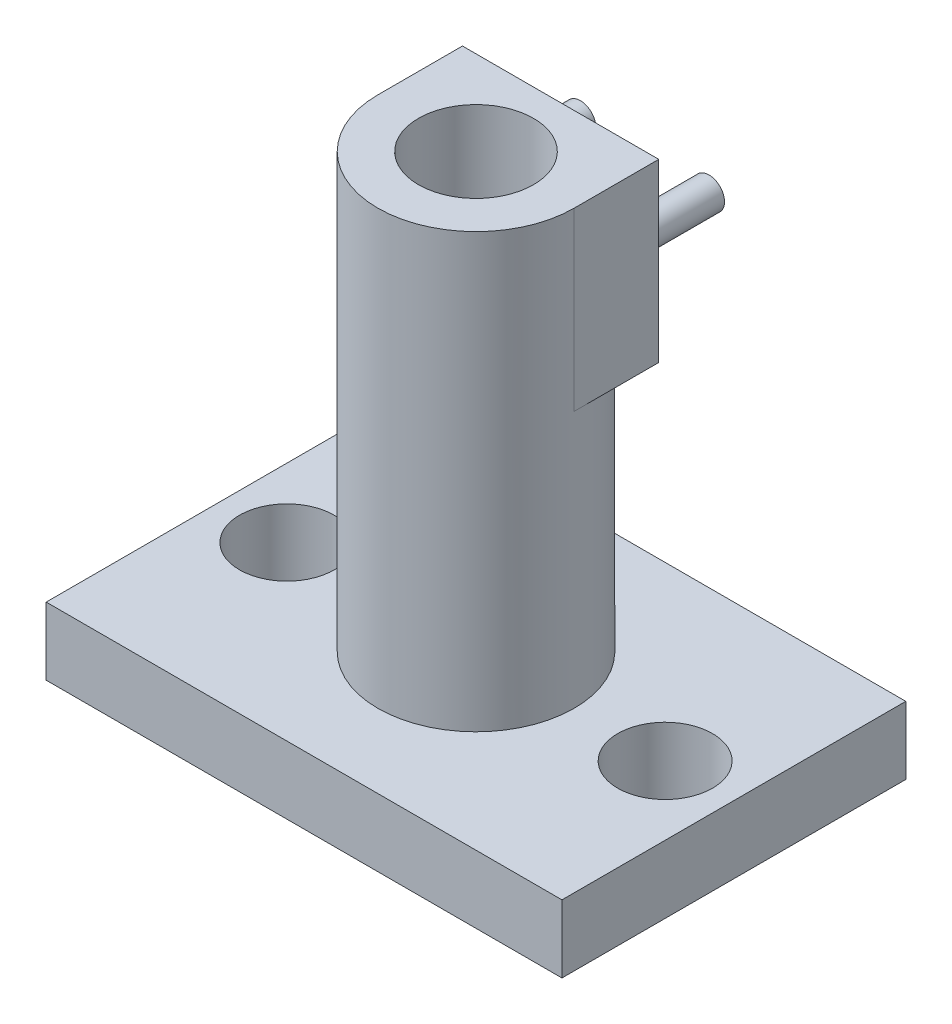
ISO-10303-21;
HEADER;
FILE_DESCRIPTION(('STEP AP214'),'2;1');
FILE_NAME('part.step','',(''),(''),'','','');
FILE_SCHEMA(('AUTOMOTIVE_DESIGN { 1 0 10303 214 1 1 1 1 }'));
ENDSEC;
DATA;
#1=APPLICATION_CONTEXT('core data for automotive mechanical design processes');
#2=APPLICATION_PROTOCOL_DEFINITION('international standard','automotive_design',2000,#1);
#3=PRODUCT_CONTEXT('',#1,'mechanical');
#4=PRODUCT('Part','Part','',(#3));
#5=PRODUCT_RELATED_PRODUCT_CATEGORY('part','',(#4));
#6=PRODUCT_DEFINITION_FORMATION('','',#4);
#7=PRODUCT_DEFINITION_CONTEXT('part definition',#1,'design');
#8=PRODUCT_DEFINITION('design','',#6,#7);
#9=PRODUCT_DEFINITION_SHAPE('','',#8);
#10=(LENGTH_UNIT() NAMED_UNIT(*) SI_UNIT(.MILLI.,.METRE.));
#11=(NAMED_UNIT(*) PLANE_ANGLE_UNIT() SI_UNIT($,.RADIAN.));
#12=(NAMED_UNIT(*) SI_UNIT($,.STERADIAN.) SOLID_ANGLE_UNIT());
#13=UNCERTAINTY_MEASURE_WITH_UNIT(LENGTH_MEASURE(1.E-05),#10,'distance_accuracy_value','');
#14=(GEOMETRIC_REPRESENTATION_CONTEXT(3) GLOBAL_UNCERTAINTY_ASSIGNED_CONTEXT((#13)) GLOBAL_UNIT_ASSIGNED_CONTEXT((#10,
#11,#12)) REPRESENTATION_CONTEXT('',''));
#15=CARTESIAN_POINT('',(0.,0.,0.));
#16=DIRECTION('',(0.,0.,1.));
#17=DIRECTION('',(1.,0.,0.));
#18=AXIS2_PLACEMENT_3D('',#15,#16,#17);
#19=CARTESIAN_POINT('',(-3.11750451625999,19.,-6.25000000000001));
#20=DIRECTION('',(0.,0.,1.));
#21=DIRECTION('',(1.,0.,0.));
#22=AXIS2_PLACEMENT_3D('',#19,#20,#21);
#23=PLANE('',#22);
#24=CARTESIAN_POINT('',(-2.04173913043476,30.5,-6.25000000000001));
#25=DIRECTION('',(0.,0.,1.));
#26=DIRECTION('',(1.,0.,0.));
#27=AXIS2_PLACEMENT_3D('',#24,#25,#26);
#28=CIRCLE('',#27,1.15);
#29=CARTESIAN_POINT('',(-0.89173913043476,30.5,-6.25000000000001));
#30=VERTEX_POINT('',#29);
#31=EDGE_CURVE('E41',#30,#30,#28,.F.);
#32=ORIENTED_EDGE('',*,*,#31,.F.);
#33=EDGE_LOOP('',(#32));
#34=FACE_BOUND('',#33,.T.);
#35=DIRECTION('',(1.,0.,0.));
#36=VECTOR('',#35,1.);
#37=CARTESIAN_POINT('',(-3.11750451625999,37.,-6.25000000000001));
#38=LINE('',#37,#36);
#39=CARTESIAN_POINT('',(-14.0417391304348,37.,-6.25000000000001));
#40=VERTEX_POINT('',#39);
#41=CARTESIAN_POINT('',(0.458260869565243,37.,-6.25000000000001));
#42=VERTEX_POINT('',#41);
#43=EDGE_CURVE('E116',#40,#42,#38,.T.);
#44=ORIENTED_EDGE('',*,*,#43,.T.);
#45=DIRECTION('',(0.,1.,0.));
#46=VECTOR('',#45,1.);
#47=CARTESIAN_POINT('',(0.458260869565243,24.,-6.25000000000001));
#48=LINE('',#47,#46);
#49=CARTESIAN_POINT('',(0.458260869565243,24.,-6.25000000000001));
#50=VERTEX_POINT('',#49);
#51=EDGE_CURVE('E109',#50,#42,#48,.T.);
#52=ORIENTED_EDGE('',*,*,#51,.F.);
#53=DIRECTION('',(-1.,0.,0.));
#54=VECTOR('',#53,1.);
#55=CARTESIAN_POINT('',(-3.11750451625999,24.,-6.25000000000001));
#56=LINE('',#55,#54);
#57=CARTESIAN_POINT('',(-3.11750451625999,24.,-6.25000000000001));
#58=VERTEX_POINT('',#57);
#59=EDGE_CURVE('E114',#50,#58,#56,.T.);
#60=ORIENTED_EDGE('',*,*,#59,.T.);
#61=DIRECTION('',(0.,1.,0.));
#62=VECTOR('',#61,1.);
#63=CARTESIAN_POINT('',(-3.11750451625999,19.,-6.25000000000001));
#64=LINE('',#63,#62);
#65=CARTESIAN_POINT('',(-3.11750451625999,19.,-6.25000000000001));
#66=VERTEX_POINT('',#65);
#67=EDGE_CURVE('E156',#66,#58,#64,.T.);
#68=ORIENTED_EDGE('',*,*,#67,.F.);
#69=DIRECTION('',(1.,0.,0.));
#70=VECTOR('',#69,1.);
#71=CARTESIAN_POINT('',(-3.11750451625999,19.,-6.25000000000001));
#72=LINE('',#71,#70);
#73=CARTESIAN_POINT('',(-10.4659737446095,19.,-6.25000000000001));
#74=VERTEX_POINT('',#73);
#75=EDGE_CURVE('E152',#74,#66,#72,.T.);
#76=ORIENTED_EDGE('',*,*,#75,.F.);
#77=DIRECTION('',(0.,1.,0.));
#78=VECTOR('',#77,1.);
#79=CARTESIAN_POINT('',(-10.4659737446095,19.,-6.25000000000001));
#80=LINE('',#79,#78);
#81=CARTESIAN_POINT('',(-10.4659737446095,24.,-6.25000000000001));
#82=VERTEX_POINT('',#81);
#83=EDGE_CURVE('E154',#74,#82,#80,.T.);
#84=ORIENTED_EDGE('',*,*,#83,.T.);
#85=DIRECTION('',(-1.,0.,0.));
#86=VECTOR('',#85,1.);
#87=CARTESIAN_POINT('',(-14.0417391304348,24.,-6.25000000000001));
#88=LINE('',#87,#86);
#89=CARTESIAN_POINT('',(-14.0417391304348,24.,-6.25000000000001));
#90=VERTEX_POINT('',#89);
#91=EDGE_CURVE('E138',#82,#90,#88,.T.);
#92=ORIENTED_EDGE('',*,*,#91,.T.);
#93=DIRECTION('',(0.,1.,0.));
#94=VECTOR('',#93,1.);
#95=CARTESIAN_POINT('',(-14.0417391304348,24.,-6.25000000000001));
#96=LINE('',#95,#94);
#97=EDGE_CURVE('E144',#90,#40,#96,.T.);
#98=ORIENTED_EDGE('',*,*,#97,.T.);
#99=EDGE_LOOP('',(#44,#52,#60,#68,#76,#84,#92,#98));
#100=FACE_BOUND('',#99,.T.);
#101=CARTESIAN_POINT('',(-11.5417391304348,30.5,-6.25000000000001));
#102=DIRECTION('',(0.,0.,1.));
#103=DIRECTION('',(1.,0.,0.));
#104=AXIS2_PLACEMENT_3D('',#101,#102,#103);
#105=CIRCLE('',#104,1.15);
#106=CARTESIAN_POINT('',(-10.3917391304348,30.5,-6.25000000000001));
#107=VERTEX_POINT('',#106);
#108=EDGE_CURVE('E11',#107,#107,#105,.F.);
#109=ORIENTED_EDGE('',*,*,#108,.F.);
#110=EDGE_LOOP('',(#109));
#111=FACE_BOUND('',#110,.T.);
#112=ADVANCED_FACE('F33',(#34,#100,#111),#23,.F.);
#113=CARTESIAN_POINT('',(-6.79173913043476,37.,0.));
#114=DIRECTION('',(0.,-1.,0.));
#115=DIRECTION('',(0.,0.,-1.));
#116=AXIS2_PLACEMENT_3D('',#113,#114,#115);
#117=CYLINDRICAL_SURFACE('',#116,7.25);
#118=CARTESIAN_POINT('',(-6.79173913043476,5.,0.));
#119=DIRECTION('',(0.,1.,0.));
#120=DIRECTION('',(0.,0.,1.));
#121=AXIS2_PLACEMENT_3D('',#118,#119,#120);
#122=CIRCLE('',#121,7.25);
#123=CARTESIAN_POINT('',(-6.79173913043476,5.,7.24999999999999));
#124=VERTEX_POINT('',#123);
#125=EDGE_CURVE('E175',#124,#124,#122,.T.);
#126=ORIENTED_EDGE('',*,*,#125,.T.);
#127=EDGE_LOOP('',(#126));
#128=FACE_BOUND('',#127,.T.);
#129=DIRECTION('',(0.,1.,0.));
#130=VECTOR('',#129,1.);
#131=CARTESIAN_POINT('',(0.458260869565244,24.,0.));
#132=LINE('',#131,#130);
#133=CARTESIAN_POINT('',(0.458260869565244,24.,0.));
#134=VERTEX_POINT('',#133);
#135=CARTESIAN_POINT('',(0.458260869565244,37.,0.));
#136=VERTEX_POINT('',#135);
#137=EDGE_CURVE('E52',#134,#136,#132,.T.);
#138=ORIENTED_EDGE('',*,*,#137,.T.);
#139=CARTESIAN_POINT('',(-6.79173913043476,37.,0.));
#140=DIRECTION('',(0.,1.,0.));
#141=DIRECTION('',(0.,0.,1.));
#142=AXIS2_PLACEMENT_3D('',#139,#140,#141);
#143=CIRCLE('',#142,7.25);
#144=CARTESIAN_POINT('',(-14.0417391304348,37.,0.));
#145=VERTEX_POINT('',#144);
#146=EDGE_CURVE('E176',#145,#136,#143,.T.);
#147=ORIENTED_EDGE('',*,*,#146,.F.);
#148=DIRECTION('',(0.,1.,0.));
#149=VECTOR('',#148,1.);
#150=CARTESIAN_POINT('',(-14.0417391304348,24.,0.));
#151=LINE('',#150,#149);
#152=CARTESIAN_POINT('',(-14.0417391304348,24.,0.));
#153=VERTEX_POINT('',#152);
#154=EDGE_CURVE('E147',#153,#145,#151,.T.);
#155=ORIENTED_EDGE('',*,*,#154,.F.);
#156=CARTESIAN_POINT('',(-6.79173913043476,24.,0.));
#157=DIRECTION('',(0.,-1.,0.));
#158=DIRECTION('',(0.,0.,1.));
#159=AXIS2_PLACEMENT_3D('',#156,#157,#158);
#160=CIRCLE('',#159,7.25);
#161=EDGE_CURVE('E135',#153,#82,#160,.T.);
#162=ORIENTED_EDGE('',*,*,#161,.T.);
#163=ORIENTED_EDGE('',*,*,#83,.F.);
#164=CARTESIAN_POINT('',(-6.79173913043476,19.,0.));
#165=DIRECTION('',(0.,1.,0.));
#166=DIRECTION('',(0.,0.,1.));
#167=AXIS2_PLACEMENT_3D('',#164,#165,#166);
#168=CIRCLE('',#167,7.25);
#169=EDGE_CURVE('E150',#66,#74,#168,.T.);
#170=ORIENTED_EDGE('',*,*,#169,.F.);
#171=ORIENTED_EDGE('',*,*,#67,.T.);
#172=CARTESIAN_POINT('',(-6.79173913043476,24.,0.));
#173=DIRECTION('',(0.,-1.,0.));
#174=DIRECTION('',(0.,0.,1.));
#175=AXIS2_PLACEMENT_3D('',#172,#173,#174);
#176=CIRCLE('',#175,7.25);
#177=EDGE_CURVE('E48',#58,#134,#176,.T.);
#178=ORIENTED_EDGE('',*,*,#177,.T.);
#179=EDGE_LOOP('',(#138,#147,#155,#162,#163,#170,#171,#178));
#180=FACE_BOUND('',#179,.T.);
#181=ADVANCED_FACE('F218',(#128,#180),#117,.T.);
#182=CARTESIAN_POINT('',(0.,5.,0.));
#183=DIRECTION('',(0.,1.,0.));
#184=DIRECTION('',(0.,0.,1.));
#185=AXIS2_PLACEMENT_3D('',#182,#183,#184);
#186=PLANE('',#185);
#187=CARTESIAN_POINT('',(-20.7617391304348,5.,0.));
#188=DIRECTION('',(0.,1.,0.));
#189=DIRECTION('',(0.,0.,1.));
#190=AXIS2_PLACEMENT_3D('',#187,#188,#189);
#191=CIRCLE('',#190,3.5);
#192=CARTESIAN_POINT('',(-20.7617391304348,5.,3.5));
#193=VERTEX_POINT('',#192);
#194=EDGE_CURVE('E158',#193,#193,#191,.T.);
#195=ORIENTED_EDGE('',*,*,#194,.F.);
#196=EDGE_LOOP('',(#195));
#197=FACE_BOUND('',#196,.T.);
#198=CARTESIAN_POINT('',(7.17826086956524,5.,0.));
#199=DIRECTION('',(0.,1.,0.));
#200=DIRECTION('',(0.,0.,1.));
#201=AXIS2_PLACEMENT_3D('',#198,#199,#200);
#202=CIRCLE('',#201,3.5);
#203=CARTESIAN_POINT('',(7.17826086956524,5.,3.5));
#204=VERTEX_POINT('',#203);
#205=EDGE_CURVE('E164',#204,#204,#202,.T.);
#206=ORIENTED_EDGE('',*,*,#205,.F.);
#207=EDGE_LOOP('',(#206));
#208=FACE_BOUND('',#207,.T.);
#209=DIRECTION('',(0.,0.,1.));
#210=VECTOR('',#209,1.);
#211=CARTESIAN_POINT('',(-25.8417391304348,5.,-12.7));
#212=LINE('',#211,#210);
#213=CARTESIAN_POINT('',(-25.8417391304348,5.,-12.7));
#214=VERTEX_POINT('',#213);
#215=CARTESIAN_POINT('',(-25.8417391304348,5.,12.7));
#216=VERTEX_POINT('',#215);
#217=EDGE_CURVE('E181',#214,#216,#212,.T.);
#218=ORIENTED_EDGE('',*,*,#217,.T.);
#219=DIRECTION('',(1.,0.,0.));
#220=VECTOR('',#219,1.);
#221=CARTESIAN_POINT('',(-25.8417391304348,5.,12.7));
#222=LINE('',#221,#220);
#223=CARTESIAN_POINT('',(12.2582608695652,5.,12.7));
#224=VERTEX_POINT('',#223);
#225=EDGE_CURVE('E184',#216,#224,#222,.T.);
#226=ORIENTED_EDGE('',*,*,#225,.T.);
#227=DIRECTION('',(0.,0.,-1.));
#228=VECTOR('',#227,1.);
#229=CARTESIAN_POINT('',(12.2582608695652,5.,-12.7));
#230=LINE('',#229,#228);
#231=CARTESIAN_POINT('',(12.2582608695652,5.,-12.7));
#232=VERTEX_POINT('',#231);
#233=EDGE_CURVE('E187',#224,#232,#230,.T.);
#234=ORIENTED_EDGE('',*,*,#233,.T.);
#235=DIRECTION('',(-1.,0.,0.));
#236=VECTOR('',#235,1.);
#237=CARTESIAN_POINT('',(-25.8417391304348,5.,-12.7));
#238=LINE('',#237,#236);
#239=EDGE_CURVE('E189',#232,#214,#238,.T.);
#240=ORIENTED_EDGE('',*,*,#239,.T.);
#241=EDGE_LOOP('',(#218,#226,#234,#240));
#242=FACE_BOUND('',#241,.T.);
#243=ORIENTED_EDGE('',*,*,#125,.F.);
#244=EDGE_LOOP('',(#243));
#245=FACE_BOUND('',#244,.T.);
#246=ADVANCED_FACE('F223',(#197,#208,#242,#245),#186,.T.);
#247=CARTESIAN_POINT('',(-25.8417391304348,5.,-12.7));
#248=DIRECTION('',(1.,0.,0.));
#249=DIRECTION('',(0.,0.,-1.));
#250=AXIS2_PLACEMENT_3D('',#247,#248,#249);
#251=PLANE('',#250);
#252=DIRECTION('',(0.,0.,1.));
#253=VECTOR('',#252,1.);
#254=CARTESIAN_POINT('',(-25.8417391304348,0.,-12.7));
#255=LINE('',#254,#253);
#256=CARTESIAN_POINT('',(-25.8417391304348,0.,-12.7));
#257=VERTEX_POINT('',#256);
#258=CARTESIAN_POINT('',(-25.8417391304348,0.,12.7));
#259=VERTEX_POINT('',#258);
#260=EDGE_CURVE('E178',#257,#259,#255,.T.);
#261=ORIENTED_EDGE('',*,*,#260,.T.);
#262=DIRECTION('',(0.,-1.,0.));
#263=VECTOR('',#262,1.);
#264=CARTESIAN_POINT('',(-25.8417391304348,5.,12.7));
#265=LINE('',#264,#263);
#266=EDGE_CURVE('E207',#216,#259,#265,.T.);
#267=ORIENTED_EDGE('',*,*,#266,.F.);
#268=ORIENTED_EDGE('',*,*,#217,.F.);
#269=DIRECTION('',(0.,-1.,0.));
#270=VECTOR('',#269,1.);
#271=CARTESIAN_POINT('',(-25.8417391304348,5.,-12.7));
#272=LINE('',#271,#270);
#273=EDGE_CURVE('E191',#214,#257,#272,.T.);
#274=ORIENTED_EDGE('',*,*,#273,.T.);
#275=EDGE_LOOP('',(#261,#267,#268,#274));
#276=FACE_BOUND('',#275,.T.);
#277=ADVANCED_FACE('F35',(#276),#251,.F.);
#278=CARTESIAN_POINT('',(-25.8417391304348,5.,12.7));
#279=DIRECTION('',(0.,0.,-1.));
#280=DIRECTION('',(-1.,0.,0.));
#281=AXIS2_PLACEMENT_3D('',#278,#279,#280);
#282=PLANE('',#281);
#283=DIRECTION('',(1.,0.,0.));
#284=VECTOR('',#283,1.);
#285=CARTESIAN_POINT('',(-25.8417391304348,0.,12.7));
#286=LINE('',#285,#284);
#287=CARTESIAN_POINT('',(12.2582608695652,0.,12.7));
#288=VERTEX_POINT('',#287);
#289=EDGE_CURVE('E194',#259,#288,#286,.T.);
#290=ORIENTED_EDGE('',*,*,#289,.T.);
#291=DIRECTION('',(0.,-1.,0.));
#292=VECTOR('',#291,1.);
#293=CARTESIAN_POINT('',(12.2582608695652,5.,12.7));
#294=LINE('',#293,#292);
#295=EDGE_CURVE('E204',#224,#288,#294,.T.);
#296=ORIENTED_EDGE('',*,*,#295,.F.);
#297=ORIENTED_EDGE('',*,*,#225,.F.);
#298=ORIENTED_EDGE('',*,*,#266,.T.);
#299=EDGE_LOOP('',(#290,#296,#297,#298));
#300=FACE_BOUND('',#299,.T.);
#301=ADVANCED_FACE('F260',(#300),#282,.F.);
#302=CARTESIAN_POINT('',(12.2582608695652,5.,-12.7));
#303=DIRECTION('',(-1.,0.,0.));
#304=DIRECTION('',(0.,0.,1.));
#305=AXIS2_PLACEMENT_3D('',#302,#303,#304);
#306=PLANE('',#305);
#307=DIRECTION('',(0.,0.,-1.));
#308=VECTOR('',#307,1.);
#309=CARTESIAN_POINT('',(12.2582608695652,0.,-12.7));
#310=LINE('',#309,#308);
#311=CARTESIAN_POINT('',(12.2582608695652,0.,-12.7));
#312=VERTEX_POINT('',#311);
#313=EDGE_CURVE('E196',#288,#312,#310,.T.);
#314=ORIENTED_EDGE('',*,*,#313,.T.);
#315=DIRECTION('',(0.,-1.,0.));
#316=VECTOR('',#315,1.);
#317=CARTESIAN_POINT('',(12.2582608695652,5.,-12.7));
#318=LINE('',#317,#316);
#319=EDGE_CURVE('E201',#232,#312,#318,.T.);
#320=ORIENTED_EDGE('',*,*,#319,.F.);
#321=ORIENTED_EDGE('',*,*,#233,.F.);
#322=ORIENTED_EDGE('',*,*,#295,.T.);
#323=EDGE_LOOP('',(#314,#320,#321,#322));
#324=FACE_BOUND('',#323,.T.);
#325=ADVANCED_FACE('F257',(#324),#306,.F.);
#326=CARTESIAN_POINT('',(-25.8417391304348,5.,-12.7));
#327=DIRECTION('',(0.,0.,1.));
#328=DIRECTION('',(1.,0.,0.));
#329=AXIS2_PLACEMENT_3D('',#326,#327,#328);
#330=PLANE('',#329);
#331=DIRECTION('',(-1.,0.,0.));
#332=VECTOR('',#331,1.);
#333=CARTESIAN_POINT('',(-25.8417391304348,0.,-12.7));
#334=LINE('',#333,#332);
#335=EDGE_CURVE('E185',#312,#257,#334,.T.);
#336=ORIENTED_EDGE('',*,*,#335,.T.);
#337=ORIENTED_EDGE('',*,*,#273,.F.);
#338=ORIENTED_EDGE('',*,*,#239,.F.);
#339=ORIENTED_EDGE('',*,*,#319,.T.);
#340=EDGE_LOOP('',(#336,#337,#338,#339));
#341=FACE_BOUND('',#340,.T.);
#342=ADVANCED_FACE('F253',(#341),#330,.F.);
#343=CARTESIAN_POINT('',(0.,0.,0.));
#344=DIRECTION('',(0.,1.,0.));
#345=DIRECTION('',(0.,0.,1.));
#346=AXIS2_PLACEMENT_3D('',#343,#344,#345);
#347=PLANE('',#346);
#348=CARTESIAN_POINT('',(-20.7617391304348,0.,0.));
#349=DIRECTION('',(0.,1.,0.));
#350=DIRECTION('',(0.,0.,1.));
#351=AXIS2_PLACEMENT_3D('',#348,#349,#350);
#352=CIRCLE('',#351,3.5);
#353=CARTESIAN_POINT('',(-20.7617391304348,0.,3.5));
#354=VERTEX_POINT('',#353);
#355=EDGE_CURVE('E161',#354,#354,#352,.T.);
#356=ORIENTED_EDGE('',*,*,#355,.T.);
#357=EDGE_LOOP('',(#356));
#358=FACE_BOUND('',#357,.T.);
#359=CARTESIAN_POINT('',(7.17826086956524,0.,0.));
#360=DIRECTION('',(0.,1.,0.));
#361=DIRECTION('',(0.,0.,1.));
#362=AXIS2_PLACEMENT_3D('',#359,#360,#361);
#363=CIRCLE('',#362,3.5);
#364=CARTESIAN_POINT('',(7.17826086956524,0.,3.5));
#365=VERTEX_POINT('',#364);
#366=EDGE_CURVE('E167',#365,#365,#363,.T.);
#367=ORIENTED_EDGE('',*,*,#366,.T.);
#368=EDGE_LOOP('',(#367));
#369=FACE_BOUND('',#368,.T.);
#370=ORIENTED_EDGE('',*,*,#260,.F.);
#371=ORIENTED_EDGE('',*,*,#335,.F.);
#372=ORIENTED_EDGE('',*,*,#313,.F.);
#373=ORIENTED_EDGE('',*,*,#289,.F.);
#374=EDGE_LOOP('',(#370,#371,#372,#373));
#375=FACE_BOUND('',#374,.T.);
#376=ADVANCED_FACE('F245',(#358,#369,#375),#347,.F.);
#377=CARTESIAN_POINT('',(-6.79173913043476,37.,0.));
#378=DIRECTION('',(0.,1.,0.));
#379=DIRECTION('',(0.,0.,1.));
#380=AXIS2_PLACEMENT_3D('',#377,#378,#379);
#381=PLANE('',#380);
#382=ORIENTED_EDGE('',*,*,#43,.F.);
#383=DIRECTION('',(0.,0.,1.));
#384=VECTOR('',#383,1.);
#385=CARTESIAN_POINT('',(-14.0417391304348,37.,0.));
#386=LINE('',#385,#384);
#387=EDGE_CURVE('E120',#40,#145,#386,.T.);
#388=ORIENTED_EDGE('',*,*,#387,.T.);
#389=ORIENTED_EDGE('',*,*,#146,.T.);
#390=DIRECTION('',(0.,0.,-1.));
#391=VECTOR('',#390,1.);
#392=CARTESIAN_POINT('',(0.458260869565244,37.,0.));
#393=LINE('',#392,#391);
#394=EDGE_CURVE('E132',#136,#42,#393,.T.);
#395=ORIENTED_EDGE('',*,*,#394,.T.);
#396=EDGE_LOOP('',(#382,#388,#389,#395));
#397=FACE_BOUND('',#396,.T.);
#398=CARTESIAN_POINT('',(-6.79173913043476,37.,0.));
#399=DIRECTION('',(0.,1.,0.));
#400=DIRECTION('',(0.,0.,1.));
#401=AXIS2_PLACEMENT_3D('',#398,#399,#400);
#402=CIRCLE('',#401,4.25);
#403=CARTESIAN_POINT('',(-6.79173913043476,37.,4.24999999999999));
#404=VERTEX_POINT('',#403);
#405=EDGE_CURVE('E170',#404,#404,#402,.T.);
#406=ORIENTED_EDGE('',*,*,#405,.F.);
#407=EDGE_LOOP('',(#406));
#408=FACE_BOUND('',#407,.T.);
#409=ADVANCED_FACE('F242',(#397,#408),#381,.T.);
#410=CARTESIAN_POINT('',(-6.79173913043476,37.,0.));
#411=DIRECTION('',(0.,-1.,0.));
#412=DIRECTION('',(0.,0.,-1.));
#413=AXIS2_PLACEMENT_3D('',#410,#411,#412);
#414=CYLINDRICAL_SURFACE('',#413,4.25);
#415=ORIENTED_EDGE('',*,*,#405,.T.);
#416=EDGE_LOOP('',(#415));
#417=FACE_BOUND('',#416,.T.);
#418=CARTESIAN_POINT('',(-6.79173913043476,5.,0.));
#419=DIRECTION('',(0.,1.,0.));
#420=DIRECTION('',(0.,0.,1.));
#421=AXIS2_PLACEMENT_3D('',#418,#419,#420);
#422=CIRCLE('',#421,4.25);
#423=CARTESIAN_POINT('',(-6.79173913043476,5.,4.24999999999999));
#424=VERTEX_POINT('',#423);
#425=EDGE_CURVE('E210',#424,#424,#422,.F.);
#426=ORIENTED_EDGE('',*,*,#425,.T.);
#427=EDGE_LOOP('',(#426));
#428=FACE_BOUND('',#427,.T.);
#429=ADVANCED_FACE('F239',(#417,#428),#414,.F.);
#430=ORIENTED_EDGE('',*,*,#425,.F.);
#431=EDGE_LOOP('',(#430));
#432=FACE_BOUND('',#431,.T.);
#433=ADVANCED_FACE('F237',(#432),#186,.T.);
#434=CARTESIAN_POINT('',(7.17826086956524,0.,0.));
#435=DIRECTION('',(0.,1.,0.));
#436=DIRECTION('',(0.,0.,1.));
#437=AXIS2_PLACEMENT_3D('',#434,#435,#436);
#438=CYLINDRICAL_SURFACE('',#437,3.5);
#439=ORIENTED_EDGE('',*,*,#366,.F.);
#440=EDGE_LOOP('',(#439));
#441=FACE_BOUND('',#440,.T.);
#442=ORIENTED_EDGE('',*,*,#205,.T.);
#443=EDGE_LOOP('',(#442));
#444=FACE_BOUND('',#443,.T.);
#445=ADVANCED_FACE('F233',(#441,#444),#438,.F.);
#446=CARTESIAN_POINT('',(-20.7617391304348,0.,0.));
#447=DIRECTION('',(0.,1.,0.));
#448=DIRECTION('',(0.,0.,1.));
#449=AXIS2_PLACEMENT_3D('',#446,#447,#448);
#450=CYLINDRICAL_SURFACE('',#449,3.5);
#451=ORIENTED_EDGE('',*,*,#355,.F.);
#452=EDGE_LOOP('',(#451));
#453=FACE_BOUND('',#452,.T.);
#454=ORIENTED_EDGE('',*,*,#194,.T.);
#455=EDGE_LOOP('',(#454));
#456=FACE_BOUND('',#455,.T.);
#457=ADVANCED_FACE('F230',(#453,#456),#450,.F.);
#458=CARTESIAN_POINT('',(-6.79173913043476,19.,0.));
#459=DIRECTION('',(0.,1.,0.));
#460=DIRECTION('',(0.,0.,1.));
#461=AXIS2_PLACEMENT_3D('',#458,#459,#460);
#462=PLANE('',#461);
#463=ORIENTED_EDGE('',*,*,#169,.T.);
#464=ORIENTED_EDGE('',*,*,#75,.T.);
#465=EDGE_LOOP('',(#463,#464));
#466=FACE_BOUND('',#465,.T.);
#467=ADVANCED_FACE('F228',(#466),#462,.T.);
#468=CARTESIAN_POINT('',(-14.0417391304348,24.,0.));
#469=DIRECTION('',(-1.,0.,0.));
#470=DIRECTION('',(0.,0.,1.));
#471=AXIS2_PLACEMENT_3D('',#468,#469,#470);
#472=PLANE('',#471);
#473=ORIENTED_EDGE('',*,*,#387,.F.);
#474=ORIENTED_EDGE('',*,*,#97,.F.);
#475=DIRECTION('',(0.,0.,1.));
#476=VECTOR('',#475,1.);
#477=CARTESIAN_POINT('',(-14.0417391304348,24.,0.));
#478=LINE('',#477,#476);
#479=EDGE_CURVE('E141',#90,#153,#478,.T.);
#480=ORIENTED_EDGE('',*,*,#479,.T.);
#481=ORIENTED_EDGE('',*,*,#154,.T.);
#482=EDGE_LOOP('',(#473,#474,#480,#481));
#483=FACE_BOUND('',#482,.T.);
#484=ADVANCED_FACE('F344',(#483),#472,.T.);
#485=CARTESIAN_POINT('',(-6.79173913043476,24.,0.));
#486=DIRECTION('',(0.,1.,0.));
#487=DIRECTION('',(0.,0.,1.));
#488=AXIS2_PLACEMENT_3D('',#485,#486,#487);
#489=PLANE('',#488);
#490=ORIENTED_EDGE('',*,*,#161,.F.);
#491=ORIENTED_EDGE('',*,*,#479,.F.);
#492=ORIENTED_EDGE('',*,*,#91,.F.);
#493=EDGE_LOOP('',(#490,#491,#492));
#494=FACE_BOUND('',#493,.T.);
#495=ADVANCED_FACE('F351',(#494),#489,.F.);
#496=CARTESIAN_POINT('',(0.458260869565244,24.,0.));
#497=DIRECTION('',(1.,0.,0.));
#498=DIRECTION('',(0.,0.,-1.));
#499=AXIS2_PLACEMENT_3D('',#496,#497,#498);
#500=PLANE('',#499);
#501=ORIENTED_EDGE('',*,*,#394,.F.);
#502=ORIENTED_EDGE('',*,*,#137,.F.);
#503=DIRECTION('',(0.,0.,-1.));
#504=VECTOR('',#503,1.);
#505=CARTESIAN_POINT('',(0.458260869565244,24.,0.));
#506=LINE('',#505,#504);
#507=EDGE_CURVE('E123',#134,#50,#506,.T.);
#508=ORIENTED_EDGE('',*,*,#507,.T.);
#509=ORIENTED_EDGE('',*,*,#51,.T.);
#510=EDGE_LOOP('',(#501,#502,#508,#509));
#511=FACE_BOUND('',#510,.T.);
#512=ADVANCED_FACE('F124',(#511),#500,.T.);
#513=CARTESIAN_POINT('',(-6.79173913043476,24.,0.));
#514=DIRECTION('',(0.,1.,0.));
#515=DIRECTION('',(0.,0.,1.));
#516=AXIS2_PLACEMENT_3D('',#513,#514,#515);
#517=PLANE('',#516);
#518=ORIENTED_EDGE('',*,*,#177,.F.);
#519=ORIENTED_EDGE('',*,*,#59,.F.);
#520=ORIENTED_EDGE('',*,*,#507,.F.);
#521=EDGE_LOOP('',(#518,#519,#520));
#522=FACE_BOUND('',#521,.T.);
#523=ADVANCED_FACE('F127',(#522),#517,.F.);
#524=CARTESIAN_POINT('',(-2.04173913043476,30.5,-12.46));
#525=DIRECTION('',(0.,0.,1.));
#526=DIRECTION('',(1.,0.,0.));
#527=AXIS2_PLACEMENT_3D('',#524,#525,#526);
#528=CYLINDRICAL_SURFACE('',#527,1.15);
#529=CARTESIAN_POINT('',(-2.04173913043476,30.5,-12.46));
#530=DIRECTION('',(0.,0.,-1.));
#531=DIRECTION('',(-1.,0.,0.));
#532=AXIS2_PLACEMENT_3D('',#529,#530,#531);
#533=CIRCLE('',#532,1.15);
#534=CARTESIAN_POINT('',(-3.19173913043476,30.5,-12.46));
#535=VERTEX_POINT('',#534);
#536=EDGE_CURVE('E133',#535,#535,#533,.T.);
#537=ORIENTED_EDGE('',*,*,#536,.F.);
#538=EDGE_LOOP('',(#537));
#539=FACE_BOUND('',#538,.T.);
#540=ORIENTED_EDGE('',*,*,#31,.T.);
#541=EDGE_LOOP('',(#540));
#542=FACE_BOUND('',#541,.T.);
#543=ADVANCED_FACE('F215',(#539,#542),#528,.T.);
#544=CARTESIAN_POINT('',(-2.04173913043476,30.5,-12.46));
#545=DIRECTION('',(0.,0.,-1.));
#546=DIRECTION('',(-1.,0.,0.));
#547=AXIS2_PLACEMENT_3D('',#544,#545,#546);
#548=PLANE('',#547);
#549=ORIENTED_EDGE('',*,*,#536,.T.);
#550=EDGE_LOOP('',(#549));
#551=FACE_BOUND('',#550,.T.);
#552=ADVANCED_FACE('F378',(#551),#548,.T.);
#553=CARTESIAN_POINT('',(-11.5417391304348,30.5,-12.46));
#554=DIRECTION('',(0.,0.,1.));
#555=DIRECTION('',(1.,0.,0.));
#556=AXIS2_PLACEMENT_3D('',#553,#554,#555);
#557=CYLINDRICAL_SURFACE('',#556,1.15);
#558=CARTESIAN_POINT('',(-11.5417391304348,30.5,-12.46));
#559=DIRECTION('',(0.,0.,-1.));
#560=DIRECTION('',(-1.,0.,0.));
#561=AXIS2_PLACEMENT_3D('',#558,#559,#560);
#562=CIRCLE('',#561,1.15);
#563=CARTESIAN_POINT('',(-12.6917391304348,30.5,-12.46));
#564=VERTEX_POINT('',#563);
#565=EDGE_CURVE('E459',#564,#564,#562,.T.);
#566=ORIENTED_EDGE('',*,*,#565,.F.);
#567=EDGE_LOOP('',(#566));
#568=FACE_BOUND('',#567,.T.);
#569=ORIENTED_EDGE('',*,*,#108,.T.);
#570=EDGE_LOOP('',(#569));
#571=FACE_BOUND('',#570,.T.);
#572=ADVANCED_FACE('F386',(#568,#571),#557,.T.);
#573=CARTESIAN_POINT('',(-11.5417391304348,30.5,-12.46));
#574=DIRECTION('',(0.,0.,-1.));
#575=DIRECTION('',(-1.,0.,0.));
#576=AXIS2_PLACEMENT_3D('',#573,#574,#575);
#577=PLANE('',#576);
#578=ORIENTED_EDGE('',*,*,#565,.T.);
#579=EDGE_LOOP('',(#578));
#580=FACE_BOUND('',#579,.T.);
#581=ADVANCED_FACE('F394',(#580),#577,.T.);
#582=CLOSED_SHELL('',(#112,#181,#246,#277,#301,#325,#342,#376,#409,#429,#433,#445,#457,#467,
#484,#495,#512,#523,#543,#552,#572,#581));
#583=MANIFOLD_SOLID_BREP('B2',#582);
#584=ADVANCED_BREP_SHAPE_REPRESENTATION('',(#18,#583),#14);
#585=SHAPE_DEFINITION_REPRESENTATION(#9,#584);
ENDSEC;
END-ISO-10303-21;
